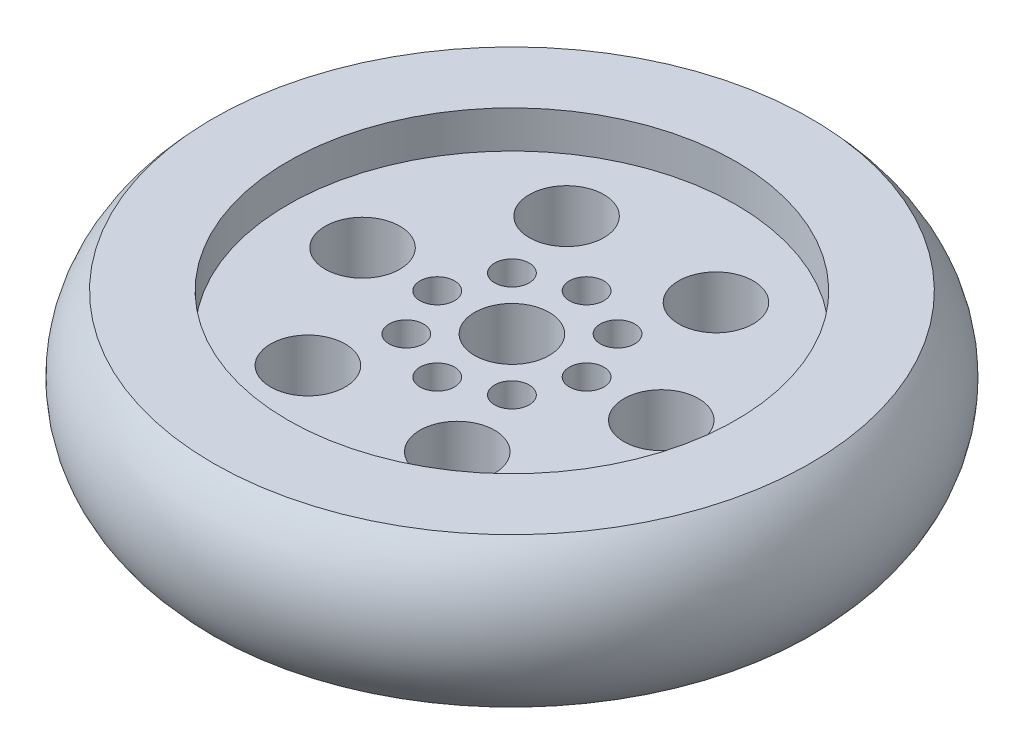
ISO-10303-21;
HEADER;
FILE_DESCRIPTION(('STEP AP214'),'2;1');
FILE_NAME('part.step','',(''),(''),'','','');
FILE_SCHEMA(('AUTOMOTIVE_DESIGN { 1 0 10303 214 1 1 1 1 }'));
ENDSEC;
DATA;
#1=APPLICATION_CONTEXT('core data for automotive mechanical design processes');
#2=APPLICATION_PROTOCOL_DEFINITION('international standard','automotive_design',2000,#1);
#3=PRODUCT_CONTEXT('',#1,'mechanical');
#4=PRODUCT('Part','Part','',(#3));
#5=PRODUCT_RELATED_PRODUCT_CATEGORY('part','',(#4));
#6=PRODUCT_DEFINITION_FORMATION('','',#4);
#7=PRODUCT_DEFINITION_CONTEXT('part definition',#1,'design');
#8=PRODUCT_DEFINITION('design','',#6,#7);
#9=PRODUCT_DEFINITION_SHAPE('','',#8);
#10=(LENGTH_UNIT() NAMED_UNIT(*) SI_UNIT(.MILLI.,.METRE.));
#11=(NAMED_UNIT(*) PLANE_ANGLE_UNIT() SI_UNIT($,.RADIAN.));
#12=(NAMED_UNIT(*) SI_UNIT($,.STERADIAN.) SOLID_ANGLE_UNIT());
#13=UNCERTAINTY_MEASURE_WITH_UNIT(LENGTH_MEASURE(1.E-05),#10,'distance_accuracy_value','');
#14=(GEOMETRIC_REPRESENTATION_CONTEXT(3) GLOBAL_UNCERTAINTY_ASSIGNED_CONTEXT((#13)) GLOBAL_UNIT_ASSIGNED_CONTEXT((#10,
#11,#12)) REPRESENTATION_CONTEXT('',''));
#15=CARTESIAN_POINT('',(0.,0.,0.));
#16=DIRECTION('',(0.,0.,1.));
#17=DIRECTION('',(1.,0.,0.));
#18=AXIS2_PLACEMENT_3D('',#15,#16,#17);
#19=CARTESIAN_POINT('',(0.,0.,0.));
#20=DIRECTION('',(0.,1.,0.));
#21=DIRECTION('',(0.,0.,1.));
#22=AXIS2_PLACEMENT_3D('',#19,#20,#21);
#23=TOROIDAL_SURFACE('',#22,24.,11.3137084989848);
#24=CARTESIAN_POINT('',(0.,8.,0.));
#25=DIRECTION('',(0.,1.,0.));
#26=DIRECTION('',(0.,0.,1.));
#27=AXIS2_PLACEMENT_3D('',#24,#25,#26);
#28=CIRCLE('',#27,32.);
#29=CARTESIAN_POINT('',(0.,8.,32.));
#30=VERTEX_POINT('',#29);
#31=EDGE_CURVE('E48',#30,#30,#28,.T.);
#32=ORIENTED_EDGE('',*,*,#31,.F.);
#33=EDGE_LOOP('',(#32));
#34=FACE_BOUND('',#33,.T.);
#35=CARTESIAN_POINT('',(0.,-8.00000000000001,0.));
#36=DIRECTION('',(0.,1.,0.));
#37=DIRECTION('',(0.,0.,1.));
#38=AXIS2_PLACEMENT_3D('',#35,#36,#37);
#39=CIRCLE('',#38,32.);
#40=CARTESIAN_POINT('',(0.,-8.00000000000001,32.));
#41=VERTEX_POINT('',#40);
#42=EDGE_CURVE('E11',#41,#41,#39,.T.);
#43=ORIENTED_EDGE('',*,*,#42,.T.);
#44=EDGE_LOOP('',(#43));
#45=FACE_BOUND('',#44,.T.);
#46=ADVANCED_FACE('F42',(#34,#45),#23,.T.);
#47=CARTESIAN_POINT('',(0.,67.1102433945442,0.));
#48=DIRECTION('',(0.,1.,0.));
#49=DIRECTION('',(0.,0.,1.));
#50=AXIS2_PLACEMENT_3D('',#47,#48,#49);
#51=CYLINDRICAL_SURFACE('',#50,32.);
#52=ORIENTED_EDGE('',*,*,#42,.F.);
#53=EDGE_LOOP('',(#52));
#54=FACE_BOUND('',#53,.T.);
#55=ORIENTED_EDGE('',*,*,#31,.T.);
#56=EDGE_LOOP('',(#55));
#57=FACE_BOUND('',#56,.T.);
#58=ADVANCED_FACE('F54',(#54,#57),#51,.F.);
#59=CLOSED_SHELL('',(#46,#58));
#60=MANIFOLD_SOLID_BREP('B2',#59);
#61=CARTESIAN_POINT('',(0.,8.,0.));
#62=DIRECTION('',(0.,-1.,0.));
#63=DIRECTION('',(0.,0.,-1.));
#64=AXIS2_PLACEMENT_3D('',#61,#62,#63);
#65=CYLINDRICAL_SURFACE('',#64,24.);
#66=CARTESIAN_POINT('',(0.,8.,0.));
#67=DIRECTION('',(0.,1.,0.));
#68=DIRECTION('',(0.,0.,1.));
#69=AXIS2_PLACEMENT_3D('',#66,#67,#68);
#70=CIRCLE('',#69,24.);
#71=CARTESIAN_POINT('',(0.,8.,24.));
#72=VERTEX_POINT('',#71);
#73=EDGE_CURVE('E88',#72,#72,#70,.T.);
#74=ORIENTED_EDGE('',*,*,#73,.T.);
#75=EDGE_LOOP('',(#74));
#76=FACE_BOUND('',#75,.T.);
#77=CARTESIAN_POINT('',(0.,-8.,0.));
#78=DIRECTION('',(0.,1.,0.));
#79=DIRECTION('',(0.,0.,1.));
#80=AXIS2_PLACEMENT_3D('',#77,#78,#79);
#81=CIRCLE('',#80,24.);
#82=CARTESIAN_POINT('',(0.,-8.,24.));
#83=VERTEX_POINT('',#82);
#84=EDGE_CURVE('E94',#83,#83,#81,.T.);
#85=ORIENTED_EDGE('',*,*,#84,.F.);
#86=EDGE_LOOP('',(#85));
#87=FACE_BOUND('',#86,.T.);
#88=ADVANCED_FACE('F81',(#76,#87),#65,.F.);
#89=CARTESIAN_POINT('',(0.,8.,0.));
#90=DIRECTION('',(0.,-1.,0.));
#91=DIRECTION('',(0.,0.,-1.));
#92=AXIS2_PLACEMENT_3D('',#89,#90,#91);
#93=CYLINDRICAL_SURFACE('',#92,32.);
#94=CARTESIAN_POINT('',(0.,8.,0.));
#95=DIRECTION('',(0.,1.,0.));
#96=DIRECTION('',(0.,0.,1.));
#97=AXIS2_PLACEMENT_3D('',#94,#95,#96);
#98=CIRCLE('',#97,32.);
#99=CARTESIAN_POINT('',(0.,8.,32.));
#100=VERTEX_POINT('',#99);
#101=EDGE_CURVE('E41',#100,#100,#98,.T.);
#102=ORIENTED_EDGE('',*,*,#101,.F.);
#103=EDGE_LOOP('',(#102));
#104=FACE_BOUND('',#103,.T.);
#105=CARTESIAN_POINT('',(0.,-8.,0.));
#106=DIRECTION('',(0.,1.,0.));
#107=DIRECTION('',(0.,0.,1.));
#108=AXIS2_PLACEMENT_3D('',#105,#106,#107);
#109=CIRCLE('',#108,32.);
#110=CARTESIAN_POINT('',(0.,-8.,32.));
#111=VERTEX_POINT('',#110);
#112=EDGE_CURVE('E84',#111,#111,#109,.T.);
#113=ORIENTED_EDGE('',*,*,#112,.T.);
#114=EDGE_LOOP('',(#113));
#115=FACE_BOUND('',#114,.T.);
#116=ADVANCED_FACE('F101',(#104,#115),#93,.T.);
#117=CARTESIAN_POINT('',(0.,8.,0.));
#118=DIRECTION('',(0.,1.,0.));
#119=DIRECTION('',(0.,0.,1.));
#120=AXIS2_PLACEMENT_3D('',#117,#118,#119);
#121=PLANE('',#120);
#122=ORIENTED_EDGE('',*,*,#73,.F.);
#123=EDGE_LOOP('',(#122));
#124=FACE_BOUND('',#123,.T.);
#125=ORIENTED_EDGE('',*,*,#101,.T.);
#126=EDGE_LOOP('',(#125));
#127=FACE_BOUND('',#126,.T.);
#128=ADVANCED_FACE('F105',(#124,#127),#121,.T.);
#129=CARTESIAN_POINT('',(0.,-8.,0.));
#130=DIRECTION('',(0.,1.,0.));
#131=DIRECTION('',(0.,0.,1.));
#132=AXIS2_PLACEMENT_3D('',#129,#130,#131);
#133=PLANE('',#132);
#134=ORIENTED_EDGE('',*,*,#84,.T.);
#135=EDGE_LOOP('',(#134));
#136=FACE_BOUND('',#135,.T.);
#137=ORIENTED_EDGE('',*,*,#112,.F.);
#138=EDGE_LOOP('',(#137));
#139=FACE_BOUND('',#138,.T.);
#140=ADVANCED_FACE('F103',(#136,#139),#133,.F.);
#141=CLOSED_SHELL('',(#88,#116,#128,#140));
#142=MANIFOLD_SOLID_BREP('B6',#141);
#143=CARTESIAN_POINT('',(16.,4.,0.));
#144=DIRECTION('',(0.,-1.,0.));
#145=DIRECTION('',(0.,0.,-1.));
#146=AXIS2_PLACEMENT_3D('',#143,#144,#145);
#147=CYLINDRICAL_SURFACE('',#146,4.);
#148=CARTESIAN_POINT('',(16.,4.,0.));
#149=DIRECTION('',(0.,1.,0.));
#150=DIRECTION('',(0.,0.,1.));
#151=AXIS2_PLACEMENT_3D('',#148,#149,#150);
#152=CIRCLE('',#151,4.);
#153=CARTESIAN_POINT('',(16.,4.,4.));
#154=VERTEX_POINT('',#153);
#155=EDGE_CURVE('E151',#154,#154,#152,.T.);
#156=ORIENTED_EDGE('',*,*,#155,.T.);
#157=EDGE_LOOP('',(#156));
#158=FACE_BOUND('',#157,.T.);
#159=CARTESIAN_POINT('',(16.,-4.,0.));
#160=DIRECTION('',(0.,1.,0.));
#161=DIRECTION('',(0.,0.,1.));
#162=AXIS2_PLACEMENT_3D('',#159,#160,#161);
#163=CIRCLE('',#162,4.);
#164=CARTESIAN_POINT('',(16.,-4.,4.));
#165=VERTEX_POINT('',#164);
#166=EDGE_CURVE('E201',#165,#165,#163,.T.);
#167=ORIENTED_EDGE('',*,*,#166,.F.);
#168=EDGE_LOOP('',(#167));
#169=FACE_BOUND('',#168,.T.);
#170=ADVANCED_FACE('F143',(#158,#169),#147,.F.);
#171=CARTESIAN_POINT('',(7.99999999999997,4.,13.856406460551));
#172=DIRECTION('',(0.,-1.,0.));
#173=DIRECTION('',(0.,0.,-1.));
#174=AXIS2_PLACEMENT_3D('',#171,#172,#173);
#175=CYLINDRICAL_SURFACE('',#174,4.);
#176=CARTESIAN_POINT('',(7.99999999999997,4.,13.856406460551));
#177=DIRECTION('',(0.,1.,0.));
#178=DIRECTION('',(0.,0.,1.));
#179=AXIS2_PLACEMENT_3D('',#176,#177,#178);
#180=CIRCLE('',#179,4.);
#181=CARTESIAN_POINT('',(7.99999999999997,4.,17.856406460551));
#182=VERTEX_POINT('',#181);
#183=EDGE_CURVE('E156',#182,#182,#180,.T.);
#184=ORIENTED_EDGE('',*,*,#183,.T.);
#185=EDGE_LOOP('',(#184));
#186=FACE_BOUND('',#185,.T.);
#187=CARTESIAN_POINT('',(7.99999999999997,-4.,13.856406460551));
#188=DIRECTION('',(0.,1.,0.));
#189=DIRECTION('',(0.,0.,1.));
#190=AXIS2_PLACEMENT_3D('',#187,#188,#189);
#191=CIRCLE('',#190,4.);
#192=CARTESIAN_POINT('',(7.99999999999997,-4.,17.856406460551));
#193=VERTEX_POINT('',#192);
#194=EDGE_CURVE('E199',#193,#193,#191,.T.);
#195=ORIENTED_EDGE('',*,*,#194,.F.);
#196=EDGE_LOOP('',(#195));
#197=FACE_BOUND('',#196,.T.);
#198=ADVANCED_FACE('F252',(#186,#197),#175,.F.);
#199=CARTESIAN_POINT('',(-8.00000000000007,4.,13.856406460551));
#200=DIRECTION('',(0.,-1.,0.));
#201=DIRECTION('',(0.,0.,-1.));
#202=AXIS2_PLACEMENT_3D('',#199,#200,#201);
#203=CYLINDRICAL_SURFACE('',#202,4.);
#204=CARTESIAN_POINT('',(-8.00000000000007,4.,13.856406460551));
#205=DIRECTION('',(0.,1.,0.));
#206=DIRECTION('',(0.,0.,1.));
#207=AXIS2_PLACEMENT_3D('',#204,#205,#206);
#208=CIRCLE('',#207,4.);
#209=CARTESIAN_POINT('',(-8.00000000000007,4.,17.856406460551));
#210=VERTEX_POINT('',#209);
#211=EDGE_CURVE('E247',#210,#210,#208,.T.);
#212=ORIENTED_EDGE('',*,*,#211,.T.);
#213=EDGE_LOOP('',(#212));
#214=FACE_BOUND('',#213,.T.);
#215=CARTESIAN_POINT('',(-8.00000000000007,-4.,13.856406460551));
#216=DIRECTION('',(0.,1.,0.));
#217=DIRECTION('',(0.,0.,1.));
#218=AXIS2_PLACEMENT_3D('',#215,#216,#217);
#219=CIRCLE('',#218,4.);
#220=CARTESIAN_POINT('',(-8.00000000000007,-4.,17.856406460551));
#221=VERTEX_POINT('',#220);
#222=EDGE_CURVE('E196',#221,#221,#219,.T.);
#223=ORIENTED_EDGE('',*,*,#222,.F.);
#224=EDGE_LOOP('',(#223));
#225=FACE_BOUND('',#224,.T.);
#226=ADVANCED_FACE('F270',(#214,#225),#203,.F.);
#227=CARTESIAN_POINT('',(-16.,4.,-1.1172740284298E-13));
#228=DIRECTION('',(0.,-1.,0.));
#229=DIRECTION('',(0.,0.,-1.));
#230=AXIS2_PLACEMENT_3D('',#227,#228,#229);
#231=CYLINDRICAL_SURFACE('',#230,4.);
#232=CARTESIAN_POINT('',(-16.,4.,-1.1172740284298E-13));
#233=DIRECTION('',(0.,1.,0.));
#234=DIRECTION('',(0.,0.,1.));
#235=AXIS2_PLACEMENT_3D('',#232,#233,#234);
#236=CIRCLE('',#235,4.);
#237=CARTESIAN_POINT('',(-16.,4.,3.99999999999989));
#238=VERTEX_POINT('',#237);
#239=EDGE_CURVE('E244',#238,#238,#236,.T.);
#240=ORIENTED_EDGE('',*,*,#239,.T.);
#241=EDGE_LOOP('',(#240));
#242=FACE_BOUND('',#241,.T.);
#243=CARTESIAN_POINT('',(-16.,-4.,-1.1172740284298E-13));
#244=DIRECTION('',(0.,1.,0.));
#245=DIRECTION('',(0.,0.,1.));
#246=AXIS2_PLACEMENT_3D('',#243,#244,#245);
#247=CIRCLE('',#246,4.);
#248=CARTESIAN_POINT('',(-16.,-4.,3.99999999999989));
#249=VERTEX_POINT('',#248);
#250=EDGE_CURVE('E193',#249,#249,#247,.T.);
#251=ORIENTED_EDGE('',*,*,#250,.F.);
#252=EDGE_LOOP('',(#251));
#253=FACE_BOUND('',#252,.T.);
#254=ADVANCED_FACE('F277',(#242,#253),#231,.F.);
#255=CARTESIAN_POINT('',(-7.99999999999987,4.,-13.8564064605511));
#256=DIRECTION('',(0.,-1.,0.));
#257=DIRECTION('',(0.,0.,-1.));
#258=AXIS2_PLACEMENT_3D('',#255,#256,#257);
#259=CYLINDRICAL_SURFACE('',#258,4.);
#260=CARTESIAN_POINT('',(-7.99999999999987,4.,-13.8564064605511));
#261=DIRECTION('',(0.,1.,0.));
#262=DIRECTION('',(0.,0.,1.));
#263=AXIS2_PLACEMENT_3D('',#260,#261,#262);
#264=CIRCLE('',#263,4.);
#265=CARTESIAN_POINT('',(-7.99999999999987,4.,-9.85640646055109));
#266=VERTEX_POINT('',#265);
#267=EDGE_CURVE('E241',#266,#266,#264,.T.);
#268=ORIENTED_EDGE('',*,*,#267,.T.);
#269=EDGE_LOOP('',(#268));
#270=FACE_BOUND('',#269,.T.);
#271=CARTESIAN_POINT('',(-7.99999999999987,-4.,-13.8564064605511));
#272=DIRECTION('',(0.,1.,0.));
#273=DIRECTION('',(0.,0.,1.));
#274=AXIS2_PLACEMENT_3D('',#271,#272,#273);
#275=CIRCLE('',#274,4.);
#276=CARTESIAN_POINT('',(-7.99999999999987,-4.,-9.85640646055109));
#277=VERTEX_POINT('',#276);
#278=EDGE_CURVE('E190',#277,#277,#275,.T.);
#279=ORIENTED_EDGE('',*,*,#278,.F.);
#280=EDGE_LOOP('',(#279));
#281=FACE_BOUND('',#280,.T.);
#282=ADVANCED_FACE('F281',(#270,#281),#259,.F.);
#283=CARTESIAN_POINT('',(8.00000000000016,4.,-13.8564064605509));
#284=DIRECTION('',(0.,-1.,0.));
#285=DIRECTION('',(0.,0.,-1.));
#286=AXIS2_PLACEMENT_3D('',#283,#284,#285);
#287=CYLINDRICAL_SURFACE('',#286,4.);
#288=CARTESIAN_POINT('',(8.00000000000016,4.,-13.8564064605509));
#289=DIRECTION('',(0.,1.,0.));
#290=DIRECTION('',(0.,0.,1.));
#291=AXIS2_PLACEMENT_3D('',#288,#289,#290);
#292=CIRCLE('',#291,4.);
#293=CARTESIAN_POINT('',(8.00000000000016,4.,-9.85640646055093));
#294=VERTEX_POINT('',#293);
#295=EDGE_CURVE('E238',#294,#294,#292,.T.);
#296=ORIENTED_EDGE('',*,*,#295,.T.);
#297=EDGE_LOOP('',(#296));
#298=FACE_BOUND('',#297,.T.);
#299=CARTESIAN_POINT('',(8.00000000000016,-4.,-13.8564064605509));
#300=DIRECTION('',(0.,1.,0.));
#301=DIRECTION('',(0.,0.,1.));
#302=AXIS2_PLACEMENT_3D('',#299,#300,#301);
#303=CIRCLE('',#302,4.);
#304=CARTESIAN_POINT('',(8.00000000000016,-4.,-9.85640646055093));
#305=VERTEX_POINT('',#304);
#306=EDGE_CURVE('E187',#305,#305,#303,.T.);
#307=ORIENTED_EDGE('',*,*,#306,.F.);
#308=EDGE_LOOP('',(#307));
#309=FACE_BOUND('',#308,.T.);
#310=ADVANCED_FACE('F285',(#298,#309),#287,.F.);
#311=CARTESIAN_POINT('',(0.,4.,0.));
#312=DIRECTION('',(0.,-1.,0.));
#313=DIRECTION('',(0.,0.,-1.));
#314=AXIS2_PLACEMENT_3D('',#311,#312,#313);
#315=CYLINDRICAL_SURFACE('',#314,4.);
#316=CARTESIAN_POINT('',(0.,4.,0.));
#317=DIRECTION('',(0.,1.,0.));
#318=DIRECTION('',(0.,0.,1.));
#319=AXIS2_PLACEMENT_3D('',#316,#317,#318);
#320=CIRCLE('',#319,4.);
#321=CARTESIAN_POINT('',(0.,4.,4.));
#322=VERTEX_POINT('',#321);
#323=EDGE_CURVE('E235',#322,#322,#320,.T.);
#324=ORIENTED_EDGE('',*,*,#323,.T.);
#325=EDGE_LOOP('',(#324));
#326=FACE_BOUND('',#325,.T.);
#327=CARTESIAN_POINT('',(0.,-4.,0.));
#328=DIRECTION('',(0.,1.,0.));
#329=DIRECTION('',(0.,0.,1.));
#330=AXIS2_PLACEMENT_3D('',#327,#328,#329);
#331=CIRCLE('',#330,4.);
#332=CARTESIAN_POINT('',(0.,-4.,4.));
#333=VERTEX_POINT('',#332);
#334=EDGE_CURVE('E184',#333,#333,#331,.T.);
#335=ORIENTED_EDGE('',*,*,#334,.F.);
#336=EDGE_LOOP('',(#335));
#337=FACE_BOUND('',#336,.T.);
#338=ADVANCED_FACE('F289',(#326,#337),#315,.F.);
#339=CARTESIAN_POINT('',(8.,4.,0.));
#340=DIRECTION('',(0.,-1.,0.));
#341=DIRECTION('',(0.,0.,-1.));
#342=AXIS2_PLACEMENT_3D('',#339,#340,#341);
#343=CYLINDRICAL_SURFACE('',#342,1.85);
#344=CARTESIAN_POINT('',(8.,4.,0.));
#345=DIRECTION('',(0.,1.,0.));
#346=DIRECTION('',(0.,0.,1.));
#347=AXIS2_PLACEMENT_3D('',#344,#345,#346);
#348=CIRCLE('',#347,1.85);
#349=CARTESIAN_POINT('',(8.,4.,1.85));
#350=VERTEX_POINT('',#349);
#351=EDGE_CURVE('E232',#350,#350,#348,.T.);
#352=ORIENTED_EDGE('',*,*,#351,.T.);
#353=EDGE_LOOP('',(#352));
#354=FACE_BOUND('',#353,.T.);
#355=CARTESIAN_POINT('',(8.,-4.,0.));
#356=DIRECTION('',(0.,1.,0.));
#357=DIRECTION('',(0.,0.,1.));
#358=AXIS2_PLACEMENT_3D('',#355,#356,#357);
#359=CIRCLE('',#358,1.85);
#360=CARTESIAN_POINT('',(8.,-4.,1.85));
#361=VERTEX_POINT('',#360);
#362=EDGE_CURVE('E181',#361,#361,#359,.T.);
#363=ORIENTED_EDGE('',*,*,#362,.F.);
#364=EDGE_LOOP('',(#363));
#365=FACE_BOUND('',#364,.T.);
#366=ADVANCED_FACE('F293',(#354,#365),#343,.F.);
#367=CARTESIAN_POINT('',(5.65685424949237,4.,5.65685424949239));
#368=DIRECTION('',(0.,-1.,0.));
#369=DIRECTION('',(0.,0.,-1.));
#370=AXIS2_PLACEMENT_3D('',#367,#368,#369);
#371=CYLINDRICAL_SURFACE('',#370,1.85);
#372=CARTESIAN_POINT('',(5.65685424949237,4.,5.65685424949239));
#373=DIRECTION('',(0.,1.,0.));
#374=DIRECTION('',(0.,0.,1.));
#375=AXIS2_PLACEMENT_3D('',#372,#373,#374);
#376=CIRCLE('',#375,1.85);
#377=CARTESIAN_POINT('',(5.65685424949237,4.,7.50685424949239));
#378=VERTEX_POINT('',#377);
#379=EDGE_CURVE('E229',#378,#378,#376,.T.);
#380=ORIENTED_EDGE('',*,*,#379,.T.);
#381=EDGE_LOOP('',(#380));
#382=FACE_BOUND('',#381,.T.);
#383=CARTESIAN_POINT('',(5.65685424949237,-4.,5.65685424949239));
#384=DIRECTION('',(0.,1.,0.));
#385=DIRECTION('',(0.,0.,1.));
#386=AXIS2_PLACEMENT_3D('',#383,#384,#385);
#387=CIRCLE('',#386,1.85);
#388=CARTESIAN_POINT('',(5.65685424949237,-4.,7.50685424949239));
#389=VERTEX_POINT('',#388);
#390=EDGE_CURVE('E178',#389,#389,#387,.T.);
#391=ORIENTED_EDGE('',*,*,#390,.F.);
#392=EDGE_LOOP('',(#391));
#393=FACE_BOUND('',#392,.T.);
#394=ADVANCED_FACE('F297',(#382,#393),#371,.F.);
#395=CARTESIAN_POINT('',(0.,4.,8.));
#396=DIRECTION('',(0.,-1.,0.));
#397=DIRECTION('',(0.,0.,-1.));
#398=AXIS2_PLACEMENT_3D('',#395,#396,#397);
#399=CYLINDRICAL_SURFACE('',#398,1.85);
#400=CARTESIAN_POINT('',(0.,4.,8.));
#401=DIRECTION('',(0.,1.,0.));
#402=DIRECTION('',(0.,0.,1.));
#403=AXIS2_PLACEMENT_3D('',#400,#401,#402);
#404=CIRCLE('',#403,1.85);
#405=CARTESIAN_POINT('',(0.,4.,9.85));
#406=VERTEX_POINT('',#405);
#407=EDGE_CURVE('E226',#406,#406,#404,.T.);
#408=ORIENTED_EDGE('',*,*,#407,.T.);
#409=EDGE_LOOP('',(#408));
#410=FACE_BOUND('',#409,.T.);
#411=CARTESIAN_POINT('',(0.,-4.,8.));
#412=DIRECTION('',(0.,1.,0.));
#413=DIRECTION('',(0.,0.,1.));
#414=AXIS2_PLACEMENT_3D('',#411,#412,#413);
#415=CIRCLE('',#414,1.85);
#416=CARTESIAN_POINT('',(0.,-4.,9.85));
#417=VERTEX_POINT('',#416);
#418=EDGE_CURVE('E175',#417,#417,#415,.T.);
#419=ORIENTED_EDGE('',*,*,#418,.F.);
#420=EDGE_LOOP('',(#419));
#421=FACE_BOUND('',#420,.T.);
#422=ADVANCED_FACE('F301',(#410,#421),#399,.F.);
#423=CARTESIAN_POINT('',(-5.65685424949241,4.,5.65685424949235));
#424=DIRECTION('',(0.,-1.,0.));
#425=DIRECTION('',(0.,0.,-1.));
#426=AXIS2_PLACEMENT_3D('',#423,#424,#425);
#427=CYLINDRICAL_SURFACE('',#426,1.85);
#428=CARTESIAN_POINT('',(-5.65685424949241,4.,5.65685424949235));
#429=DIRECTION('',(0.,1.,0.));
#430=DIRECTION('',(0.,0.,1.));
#431=AXIS2_PLACEMENT_3D('',#428,#429,#430);
#432=CIRCLE('',#431,1.85);
#433=CARTESIAN_POINT('',(-5.65685424949241,4.,7.50685424949235));
#434=VERTEX_POINT('',#433);
#435=EDGE_CURVE('E223',#434,#434,#432,.T.);
#436=ORIENTED_EDGE('',*,*,#435,.T.);
#437=EDGE_LOOP('',(#436));
#438=FACE_BOUND('',#437,.T.);
#439=CARTESIAN_POINT('',(-5.65685424949241,-4.,5.65685424949235));
#440=DIRECTION('',(0.,1.,0.));
#441=DIRECTION('',(0.,0.,1.));
#442=AXIS2_PLACEMENT_3D('',#439,#440,#441);
#443=CIRCLE('',#442,1.85);
#444=CARTESIAN_POINT('',(-5.65685424949241,-4.,7.50685424949235));
#445=VERTEX_POINT('',#444);
#446=EDGE_CURVE('E172',#445,#445,#443,.T.);
#447=ORIENTED_EDGE('',*,*,#446,.F.);
#448=EDGE_LOOP('',(#447));
#449=FACE_BOUND('',#448,.T.);
#450=ADVANCED_FACE('F305',(#438,#449),#427,.F.);
#451=CARTESIAN_POINT('',(-8.,4.,0.));
#452=DIRECTION('',(0.,-1.,0.));
#453=DIRECTION('',(0.,0.,-1.));
#454=AXIS2_PLACEMENT_3D('',#451,#452,#453);
#455=CYLINDRICAL_SURFACE('',#454,1.85);
#456=CARTESIAN_POINT('',(-8.,4.,0.));
#457=DIRECTION('',(0.,1.,0.));
#458=DIRECTION('',(0.,0.,1.));
#459=AXIS2_PLACEMENT_3D('',#456,#457,#458);
#460=CIRCLE('',#459,1.85);
#461=CARTESIAN_POINT('',(-8.,4.,1.84999999999995));
#462=VERTEX_POINT('',#461);
#463=EDGE_CURVE('E220',#462,#462,#460,.T.);
#464=ORIENTED_EDGE('',*,*,#463,.T.);
#465=EDGE_LOOP('',(#464));
#466=FACE_BOUND('',#465,.T.);
#467=CARTESIAN_POINT('',(-8.,-4.,0.));
#468=DIRECTION('',(0.,1.,0.));
#469=DIRECTION('',(0.,0.,1.));
#470=AXIS2_PLACEMENT_3D('',#467,#468,#469);
#471=CIRCLE('',#470,1.85);
#472=CARTESIAN_POINT('',(-8.,-4.,1.84999999999995));
#473=VERTEX_POINT('',#472);
#474=EDGE_CURVE('E169',#473,#473,#471,.T.);
#475=ORIENTED_EDGE('',*,*,#474,.F.);
#476=EDGE_LOOP('',(#475));
#477=FACE_BOUND('',#476,.T.);
#478=ADVANCED_FACE('F309',(#466,#477),#455,.F.);
#479=CARTESIAN_POINT('',(-5.65685424949233,4.,-5.65685424949243));
#480=DIRECTION('',(0.,-1.,0.));
#481=DIRECTION('',(0.,0.,-1.));
#482=AXIS2_PLACEMENT_3D('',#479,#480,#481);
#483=CYLINDRICAL_SURFACE('',#482,1.85);
#484=CARTESIAN_POINT('',(-5.65685424949233,4.,-5.65685424949243));
#485=DIRECTION('',(0.,1.,0.));
#486=DIRECTION('',(0.,0.,1.));
#487=AXIS2_PLACEMENT_3D('',#484,#485,#486);
#488=CIRCLE('',#487,1.85);
#489=CARTESIAN_POINT('',(-5.65685424949233,4.,-3.80685424949243));
#490=VERTEX_POINT('',#489);
#491=EDGE_CURVE('E215',#490,#490,#488,.T.);
#492=ORIENTED_EDGE('',*,*,#491,.T.);
#493=EDGE_LOOP('',(#492));
#494=FACE_BOUND('',#493,.T.);
#495=CARTESIAN_POINT('',(-5.65685424949233,-4.,-5.65685424949243));
#496=DIRECTION('',(0.,1.,0.));
#497=DIRECTION('',(0.,0.,1.));
#498=AXIS2_PLACEMENT_3D('',#495,#496,#497);
#499=CIRCLE('',#498,1.85);
#500=CARTESIAN_POINT('',(-5.65685424949233,-4.,-3.80685424949243));
#501=VERTEX_POINT('',#500);
#502=EDGE_CURVE('E166',#501,#501,#499,.T.);
#503=ORIENTED_EDGE('',*,*,#502,.F.);
#504=EDGE_LOOP('',(#503));
#505=FACE_BOUND('',#504,.T.);
#506=ADVANCED_FACE('F313',(#494,#505),#483,.F.);
#507=CARTESIAN_POINT('',(0.,4.,-8.));
#508=DIRECTION('',(0.,-1.,0.));
#509=DIRECTION('',(0.,0.,-1.));
#510=AXIS2_PLACEMENT_3D('',#507,#508,#509);
#511=CYLINDRICAL_SURFACE('',#510,1.85);
#512=CARTESIAN_POINT('',(0.,4.,-8.));
#513=DIRECTION('',(0.,1.,0.));
#514=DIRECTION('',(0.,0.,1.));
#515=AXIS2_PLACEMENT_3D('',#512,#513,#514);
#516=CIRCLE('',#515,1.85);
#517=CARTESIAN_POINT('',(0.,4.,-6.15));
#518=VERTEX_POINT('',#517);
#519=EDGE_CURVE('E210',#518,#518,#516,.T.);
#520=ORIENTED_EDGE('',*,*,#519,.T.);
#521=EDGE_LOOP('',(#520));
#522=FACE_BOUND('',#521,.T.);
#523=CARTESIAN_POINT('',(0.,-4.,-8.));
#524=DIRECTION('',(0.,1.,0.));
#525=DIRECTION('',(0.,0.,1.));
#526=AXIS2_PLACEMENT_3D('',#523,#524,#525);
#527=CIRCLE('',#526,1.85);
#528=CARTESIAN_POINT('',(0.,-4.,-6.15));
#529=VERTEX_POINT('',#528);
#530=EDGE_CURVE('E163',#529,#529,#527,.T.);
#531=ORIENTED_EDGE('',*,*,#530,.F.);
#532=EDGE_LOOP('',(#531));
#533=FACE_BOUND('',#532,.T.);
#534=ADVANCED_FACE('F316',(#522,#533),#511,.F.);
#535=CARTESIAN_POINT('',(5.65685424949245,4.,-5.65685424949231));
#536=DIRECTION('',(0.,-1.,0.));
#537=DIRECTION('',(0.,0.,-1.));
#538=AXIS2_PLACEMENT_3D('',#535,#536,#537);
#539=CYLINDRICAL_SURFACE('',#538,1.85);
#540=CARTESIAN_POINT('',(5.65685424949245,4.,-5.65685424949231));
#541=DIRECTION('',(0.,1.,0.));
#542=DIRECTION('',(0.,0.,1.));
#543=AXIS2_PLACEMENT_3D('',#540,#541,#542);
#544=CIRCLE('',#543,1.85);
#545=CARTESIAN_POINT('',(5.65685424949245,4.,-3.80685424949231));
#546=VERTEX_POINT('',#545);
#547=EDGE_CURVE('E206',#546,#546,#544,.T.);
#548=ORIENTED_EDGE('',*,*,#547,.T.);
#549=EDGE_LOOP('',(#548));
#550=FACE_BOUND('',#549,.T.);
#551=CARTESIAN_POINT('',(5.65685424949245,-4.,-5.65685424949231));
#552=DIRECTION('',(0.,1.,0.));
#553=DIRECTION('',(0.,0.,1.));
#554=AXIS2_PLACEMENT_3D('',#551,#552,#553);
#555=CIRCLE('',#554,1.85);
#556=CARTESIAN_POINT('',(5.65685424949245,-4.,-3.80685424949231));
#557=VERTEX_POINT('',#556);
#558=EDGE_CURVE('E160',#557,#557,#555,.T.);
#559=ORIENTED_EDGE('',*,*,#558,.F.);
#560=EDGE_LOOP('',(#559));
#561=FACE_BOUND('',#560,.T.);
#562=ADVANCED_FACE('F145',(#550,#561),#539,.F.);
#563=CARTESIAN_POINT('',(0.,4.,0.));
#564=DIRECTION('',(0.,-1.,0.));
#565=DIRECTION('',(0.,0.,-1.));
#566=AXIS2_PLACEMENT_3D('',#563,#564,#565);
#567=CYLINDRICAL_SURFACE('',#566,24.);
#568=CARTESIAN_POINT('',(0.,4.,0.));
#569=DIRECTION('',(0.,1.,0.));
#570=DIRECTION('',(0.,0.,1.));
#571=AXIS2_PLACEMENT_3D('',#568,#569,#570);
#572=CIRCLE('',#571,24.);
#573=CARTESIAN_POINT('',(0.,4.,24.));
#574=VERTEX_POINT('',#573);
#575=EDGE_CURVE('E80',#574,#574,#572,.T.);
#576=ORIENTED_EDGE('',*,*,#575,.F.);
#577=EDGE_LOOP('',(#576));
#578=FACE_BOUND('',#577,.T.);
#579=CARTESIAN_POINT('',(0.,-4.,0.));
#580=DIRECTION('',(0.,1.,0.));
#581=DIRECTION('',(0.,0.,1.));
#582=AXIS2_PLACEMENT_3D('',#579,#580,#581);
#583=CIRCLE('',#582,24.);
#584=CARTESIAN_POINT('',(0.,-4.,24.));
#585=VERTEX_POINT('',#584);
#586=EDGE_CURVE('E147',#585,#585,#583,.T.);
#587=ORIENTED_EDGE('',*,*,#586,.T.);
#588=EDGE_LOOP('',(#587));
#589=FACE_BOUND('',#588,.T.);
#590=ADVANCED_FACE('F259',(#578,#589),#567,.T.);
#591=CARTESIAN_POINT('',(0.,4.,0.));
#592=DIRECTION('',(0.,1.,0.));
#593=DIRECTION('',(0.,0.,1.));
#594=AXIS2_PLACEMENT_3D('',#591,#592,#593);
#595=PLANE('',#594);
#596=ORIENTED_EDGE('',*,*,#547,.F.);
#597=EDGE_LOOP('',(#596));
#598=FACE_BOUND('',#597,.T.);
#599=ORIENTED_EDGE('',*,*,#519,.F.);
#600=EDGE_LOOP('',(#599));
#601=FACE_BOUND('',#600,.T.);
#602=ORIENTED_EDGE('',*,*,#491,.F.);
#603=EDGE_LOOP('',(#602));
#604=FACE_BOUND('',#603,.T.);
#605=ORIENTED_EDGE('',*,*,#463,.F.);
#606=EDGE_LOOP('',(#605));
#607=FACE_BOUND('',#606,.T.);
#608=ORIENTED_EDGE('',*,*,#435,.F.);
#609=EDGE_LOOP('',(#608));
#610=FACE_BOUND('',#609,.T.);
#611=ORIENTED_EDGE('',*,*,#407,.F.);
#612=EDGE_LOOP('',(#611));
#613=FACE_BOUND('',#612,.T.);
#614=ORIENTED_EDGE('',*,*,#379,.F.);
#615=EDGE_LOOP('',(#614));
#616=FACE_BOUND('',#615,.T.);
#617=ORIENTED_EDGE('',*,*,#351,.F.);
#618=EDGE_LOOP('',(#617));
#619=FACE_BOUND('',#618,.T.);
#620=ORIENTED_EDGE('',*,*,#323,.F.);
#621=EDGE_LOOP('',(#620));
#622=FACE_BOUND('',#621,.T.);
#623=ORIENTED_EDGE('',*,*,#295,.F.);
#624=EDGE_LOOP('',(#623));
#625=FACE_BOUND('',#624,.T.);
#626=ORIENTED_EDGE('',*,*,#267,.F.);
#627=EDGE_LOOP('',(#626));
#628=FACE_BOUND('',#627,.T.);
#629=ORIENTED_EDGE('',*,*,#239,.F.);
#630=EDGE_LOOP('',(#629));
#631=FACE_BOUND('',#630,.T.);
#632=ORIENTED_EDGE('',*,*,#211,.F.);
#633=EDGE_LOOP('',(#632));
#634=FACE_BOUND('',#633,.T.);
#635=ORIENTED_EDGE('',*,*,#183,.F.);
#636=EDGE_LOOP('',(#635));
#637=FACE_BOUND('',#636,.T.);
#638=ORIENTED_EDGE('',*,*,#155,.F.);
#639=EDGE_LOOP('',(#638));
#640=FACE_BOUND('',#639,.T.);
#641=ORIENTED_EDGE('',*,*,#575,.T.);
#642=EDGE_LOOP('',(#641));
#643=FACE_BOUND('',#642,.T.);
#644=ADVANCED_FACE('F255',(#598,#601,#604,#607,#610,#613,#616,#619,#622,#625,#628,#631,#634,
#637,#640,#643),#595,.T.);
#645=CARTESIAN_POINT('',(0.,-4.,0.));
#646=DIRECTION('',(0.,1.,0.));
#647=DIRECTION('',(0.,0.,1.));
#648=AXIS2_PLACEMENT_3D('',#645,#646,#647);
#649=PLANE('',#648);
#650=ORIENTED_EDGE('',*,*,#558,.T.);
#651=EDGE_LOOP('',(#650));
#652=FACE_BOUND('',#651,.T.);
#653=ORIENTED_EDGE('',*,*,#530,.T.);
#654=EDGE_LOOP('',(#653));
#655=FACE_BOUND('',#654,.T.);
#656=ORIENTED_EDGE('',*,*,#502,.T.);
#657=EDGE_LOOP('',(#656));
#658=FACE_BOUND('',#657,.T.);
#659=ORIENTED_EDGE('',*,*,#474,.T.);
#660=EDGE_LOOP('',(#659));
#661=FACE_BOUND('',#660,.T.);
#662=ORIENTED_EDGE('',*,*,#446,.T.);
#663=EDGE_LOOP('',(#662));
#664=FACE_BOUND('',#663,.T.);
#665=ORIENTED_EDGE('',*,*,#418,.T.);
#666=EDGE_LOOP('',(#665));
#667=FACE_BOUND('',#666,.T.);
#668=ORIENTED_EDGE('',*,*,#390,.T.);
#669=EDGE_LOOP('',(#668));
#670=FACE_BOUND('',#669,.T.);
#671=ORIENTED_EDGE('',*,*,#362,.T.);
#672=EDGE_LOOP('',(#671));
#673=FACE_BOUND('',#672,.T.);
#674=ORIENTED_EDGE('',*,*,#334,.T.);
#675=EDGE_LOOP('',(#674));
#676=FACE_BOUND('',#675,.T.);
#677=ORIENTED_EDGE('',*,*,#306,.T.);
#678=EDGE_LOOP('',(#677));
#679=FACE_BOUND('',#678,.T.);
#680=ORIENTED_EDGE('',*,*,#278,.T.);
#681=EDGE_LOOP('',(#680));
#682=FACE_BOUND('',#681,.T.);
#683=ORIENTED_EDGE('',*,*,#250,.T.);
#684=EDGE_LOOP('',(#683));
#685=FACE_BOUND('',#684,.T.);
#686=ORIENTED_EDGE('',*,*,#222,.T.);
#687=EDGE_LOOP('',(#686));
#688=FACE_BOUND('',#687,.T.);
#689=ORIENTED_EDGE('',*,*,#194,.T.);
#690=EDGE_LOOP('',(#689));
#691=FACE_BOUND('',#690,.T.);
#692=ORIENTED_EDGE('',*,*,#166,.T.);
#693=EDGE_LOOP('',(#692));
#694=FACE_BOUND('',#693,.T.);
#695=ORIENTED_EDGE('',*,*,#586,.F.);
#696=EDGE_LOOP('',(#695));
#697=FACE_BOUND('',#696,.T.);
#698=ADVANCED_FACE('F258',(#652,#655,#658,#661,#664,#667,#670,#673,#676,#679,#682,#685,#688,
#691,#694,#697),#649,.F.);
#699=CLOSED_SHELL('',(#170,#198,#226,#254,#282,#310,#338,#366,#394,#422,#450,#478,#506,#534,
#562,#590,#644,#698));
#700=MANIFOLD_SOLID_BREP('B36',#699);
#701=ADVANCED_BREP_SHAPE_REPRESENTATION('',(#18,#60,#142,#700),#14);
#702=SHAPE_DEFINITION_REPRESENTATION(#9,#701);
ENDSEC;
END-ISO-10303-21;
